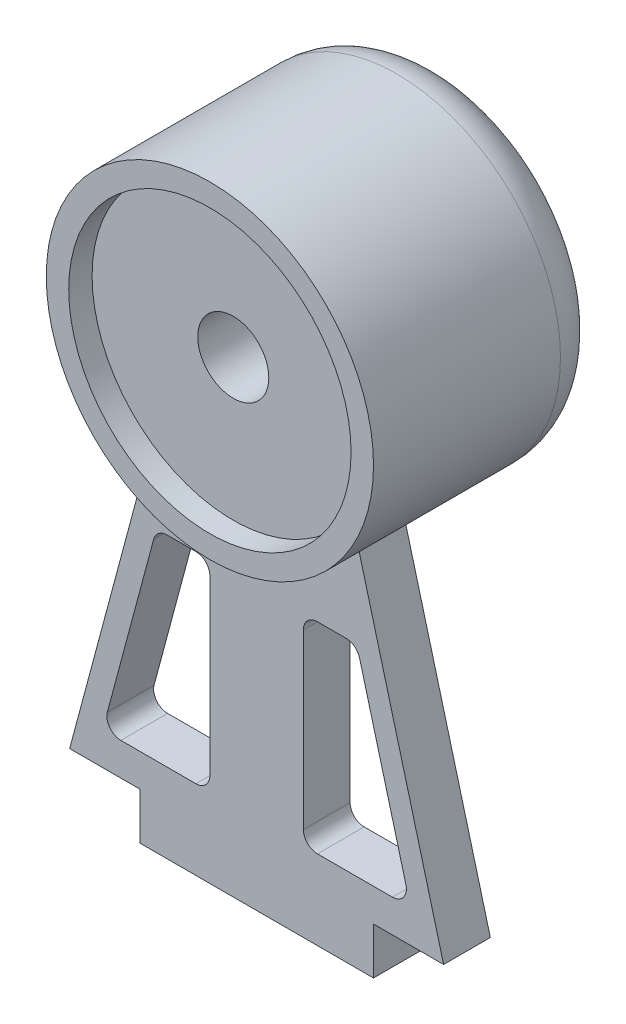
ISO-10303-21;
HEADER;
FILE_DESCRIPTION(('STEP AP214'),'2;1');
FILE_NAME('part.step','',(''),(''),'','','');
FILE_SCHEMA(('AUTOMOTIVE_DESIGN { 1 0 10303 214 1 1 1 1 }'));
ENDSEC;
DATA;
#1=APPLICATION_CONTEXT('core data for automotive mechanical design processes');
#2=APPLICATION_PROTOCOL_DEFINITION('international standard','automotive_design',2000,#1);
#3=PRODUCT_CONTEXT('',#1,'mechanical');
#4=PRODUCT('Part','Part','',(#3));
#5=PRODUCT_RELATED_PRODUCT_CATEGORY('part','',(#4));
#6=PRODUCT_DEFINITION_FORMATION('','',#4);
#7=PRODUCT_DEFINITION_CONTEXT('part definition',#1,'design');
#8=PRODUCT_DEFINITION('design','',#6,#7);
#9=PRODUCT_DEFINITION_SHAPE('','',#8);
#10=(LENGTH_UNIT() NAMED_UNIT(*) SI_UNIT(.MILLI.,.METRE.));
#11=(NAMED_UNIT(*) PLANE_ANGLE_UNIT() SI_UNIT($,.RADIAN.));
#12=(NAMED_UNIT(*) SI_UNIT($,.STERADIAN.) SOLID_ANGLE_UNIT());
#13=UNCERTAINTY_MEASURE_WITH_UNIT(LENGTH_MEASURE(1.E-05),#10,'distance_accuracy_value','');
#14=(GEOMETRIC_REPRESENTATION_CONTEXT(3) GLOBAL_UNCERTAINTY_ASSIGNED_CONTEXT((#13)) GLOBAL_UNIT_ASSIGNED_CONTEXT((#10,
#11,#12)) REPRESENTATION_CONTEXT('',''));
#15=CARTESIAN_POINT('',(0.,0.,0.));
#16=DIRECTION('',(0.,0.,1.));
#17=DIRECTION('',(1.,0.,0.));
#18=AXIS2_PLACEMENT_3D('',#15,#16,#17);
#19=CARTESIAN_POINT('',(0.,0.,0.));
#20=DIRECTION('',(0.,0.,1.));
#21=DIRECTION('',(1.,0.,0.));
#22=AXIS2_PLACEMENT_3D('',#19,#20,#21);
#23=CYLINDRICAL_SURFACE('',#22,22.225);
#24=CARTESIAN_POINT('',(0.,0.,9.52499999999999));
#25=DIRECTION('',(0.,0.,1.));
#26=DIRECTION('',(1.,0.,0.));
#27=AXIS2_PLACEMENT_3D('',#24,#25,#26);
#28=CIRCLE('',#27,22.225);
#29=CARTESIAN_POINT('',(22.225,0.,9.52499999999999));
#30=VERTEX_POINT('',#29);
#31=EDGE_CURVE('E404',#30,#30,#28,.T.);
#32=ORIENTED_EDGE('',*,*,#31,.F.);
#33=EDGE_LOOP('',(#32));
#34=FACE_BOUND('',#33,.T.);
#35=CARTESIAN_POINT('',(0.,0.,-15.875));
#36=DIRECTION('',(0.,0.,1.));
#37=DIRECTION('',(1.,0.,0.));
#38=AXIS2_PLACEMENT_3D('',#35,#36,#37);
#39=CIRCLE('',#38,22.225);
#40=CARTESIAN_POINT('',(22.225,0.,-15.875));
#41=VERTEX_POINT('',#40);
#42=EDGE_CURVE('E410',#41,#41,#39,.T.);
#43=ORIENTED_EDGE('',*,*,#42,.T.);
#44=EDGE_LOOP('',(#43));
#45=FACE_BOUND('',#44,.T.);
#46=DIRECTION('',(0.,0.,1.));
#47=VECTOR('',#46,1.);
#48=CARTESIAN_POINT('',(-13.8857617106543,-17.3532776937075,0.));
#49=LINE('',#48,#47);
#50=CARTESIAN_POINT('',(-13.8857617106543,-17.3532776937075,-3.175));
#51=VERTEX_POINT('',#50);
#52=CARTESIAN_POINT('',(-13.8857617106543,-17.3532776937075,3.175));
#53=VERTEX_POINT('',#52);
#54=EDGE_CURVE('E418',#51,#53,#49,.T.);
#55=ORIENTED_EDGE('',*,*,#54,.T.);
#56=CARTESIAN_POINT('',(0.,0.,3.175));
#57=DIRECTION('',(0.,0.,-1.));
#58=DIRECTION('',(-1.,0.,0.));
#59=AXIS2_PLACEMENT_3D('',#56,#57,#58);
#60=CIRCLE('',#59,22.225);
#61=CARTESIAN_POINT('',(13.8857617106543,-17.3532776937075,3.175));
#62=VERTEX_POINT('',#61);
#63=EDGE_CURVE('E425',#53,#62,#60,.F.);
#64=ORIENTED_EDGE('',*,*,#63,.T.);
#65=DIRECTION('',(0.,0.,1.));
#66=VECTOR('',#65,1.);
#67=CARTESIAN_POINT('',(13.8857617106543,-17.3532776937075,0.));
#68=LINE('',#67,#66);
#69=CARTESIAN_POINT('',(13.8857617106543,-17.3532776937075,-3.175));
#70=VERTEX_POINT('',#69);
#71=EDGE_CURVE('E420',#62,#70,#68,.F.);
#72=ORIENTED_EDGE('',*,*,#71,.T.);
#73=CARTESIAN_POINT('',(0.,0.,-3.175));
#74=DIRECTION('',(0.,0.,-1.));
#75=DIRECTION('',(-1.,0.,0.));
#76=AXIS2_PLACEMENT_3D('',#73,#74,#75);
#77=CIRCLE('',#76,22.225);
#78=EDGE_CURVE('E11',#51,#70,#77,.F.);
#79=ORIENTED_EDGE('',*,*,#78,.F.);
#80=EDGE_LOOP('',(#55,#64,#72,#79));
#81=FACE_BOUND('',#80,.T.);
#82=ADVANCED_FACE('F43',(#34,#45,#81),#23,.T.);
#83=CARTESIAN_POINT('',(0.,22.225,9.52499999999999));
#84=DIRECTION('',(0.,0.,-1.));
#85=DIRECTION('',(-1.,0.,0.));
#86=AXIS2_PLACEMENT_3D('',#83,#84,#85);
#87=PLANE('',#86);
#88=CARTESIAN_POINT('',(0.,0.,9.525));
#89=DIRECTION('',(0.,0.,1.));
#90=DIRECTION('',(1.,0.,0.));
#91=AXIS2_PLACEMENT_3D('',#88,#89,#90);
#92=CIRCLE('',#91,19.177);
#93=CARTESIAN_POINT('',(19.177,0.,9.525));
#94=VERTEX_POINT('',#93);
#95=EDGE_CURVE('E399',#94,#94,#92,.T.);
#96=ORIENTED_EDGE('',*,*,#95,.F.);
#97=EDGE_LOOP('',(#96));
#98=FACE_BOUND('',#97,.T.);
#99=ORIENTED_EDGE('',*,*,#31,.T.);
#100=EDGE_LOOP('',(#99));
#101=FACE_BOUND('',#100,.T.);
#102=ADVANCED_FACE('F539',(#98,#101),#87,.F.);
#103=CARTESIAN_POINT('',(0.,0.,-22.225));
#104=DIRECTION('',(0.,0.,1.));
#105=DIRECTION('',(1.,0.,0.));
#106=AXIS2_PLACEMENT_3D('',#103,#104,#105);
#107=PLANE('',#106);
#108=CARTESIAN_POINT('',(0.,0.,-22.225));
#109=DIRECTION('',(0.,0.,1.));
#110=DIRECTION('',(1.,0.,0.));
#111=AXIS2_PLACEMENT_3D('',#108,#109,#110);
#112=CIRCLE('',#111,15.875);
#113=CARTESIAN_POINT('',(15.875,0.,-22.225));
#114=VERTEX_POINT('',#113);
#115=EDGE_CURVE('E415',#114,#114,#112,.T.);
#116=ORIENTED_EDGE('',*,*,#115,.F.);
#117=EDGE_LOOP('',(#116));
#118=FACE_BOUND('',#117,.T.);
#119=ADVANCED_FACE('F550',(#118),#107,.F.);
#120=CARTESIAN_POINT('',(0.,0.,-15.875));
#121=DIRECTION('',(0.,0.,1.));
#122=DIRECTION('',(1.,0.,0.));
#123=AXIS2_PLACEMENT_3D('',#120,#121,#122);
#124=TOROIDAL_SURFACE('',#123,15.875,6.35);
#125=ORIENTED_EDGE('',*,*,#42,.F.);
#126=EDGE_LOOP('',(#125));
#127=FACE_BOUND('',#126,.T.);
#128=ORIENTED_EDGE('',*,*,#115,.T.);
#129=EDGE_LOOP('',(#128));
#130=FACE_BOUND('',#129,.T.);
#131=ADVANCED_FACE('F559',(#127,#130),#124,.T.);
#132=CARTESIAN_POINT('',(9.23596496659224,0.,3.175));
#133=DIRECTION('',(-0.965925826289067,-0.258819045102525,0.));
#134=DIRECTION('',(0.258819045102525,-0.965925826289067,0.));
#135=AXIS2_PLACEMENT_3D('',#132,#133,#134);
#136=PLANE('',#135);
#137=ORIENTED_EDGE('',*,*,#71,.F.);
#138=DIRECTION('',(-0.258819045102525,0.965925826289067,0.));
#139=VECTOR('',#138,1.);
#140=CARTESIAN_POINT('',(9.23596496659224,0.,3.175));
#141=LINE('',#140,#139);
#142=CARTESIAN_POINT('',(25.4,-60.325,3.175));
#143=VERTEX_POINT('',#142);
#144=EDGE_CURVE('E426',#143,#62,#141,.T.);
#145=ORIENTED_EDGE('',*,*,#144,.F.);
#146=DIRECTION('',(0.,0.,-1.));
#147=VECTOR('',#146,1.);
#148=CARTESIAN_POINT('',(25.4,-60.325,3.175));
#149=LINE('',#148,#147);
#150=CARTESIAN_POINT('',(25.4,-60.325,-3.175));
#151=VERTEX_POINT('',#150);
#152=EDGE_CURVE('E448',#143,#151,#149,.T.);
#153=ORIENTED_EDGE('',*,*,#152,.T.);
#154=DIRECTION('',(-0.258819045102525,0.965925826289067,0.));
#155=VECTOR('',#154,1.);
#156=CARTESIAN_POINT('',(9.23596496659224,0.,-3.175));
#157=LINE('',#156,#155);
#158=EDGE_CURVE('E422',#151,#70,#157,.T.);
#159=ORIENTED_EDGE('',*,*,#158,.T.);
#160=EDGE_LOOP('',(#137,#145,#153,#159));
#161=FACE_BOUND('',#160,.T.);
#162=ADVANCED_FACE('F44',(#161),#136,.F.);
#163=CARTESIAN_POINT('',(-9.23596496659224,0.,3.175));
#164=DIRECTION('',(0.965925826289067,-0.258819045102525,0.));
#165=DIRECTION('',(0.258819045102525,0.965925826289067,0.));
#166=AXIS2_PLACEMENT_3D('',#163,#164,#165);
#167=PLANE('',#166);
#168=ORIENTED_EDGE('',*,*,#54,.F.);
#169=DIRECTION('',(-0.258819045102525,-0.965925826289067,0.));
#170=VECTOR('',#169,1.);
#171=CARTESIAN_POINT('',(-9.23596496659224,0.,-3.175));
#172=LINE('',#171,#170);
#173=CARTESIAN_POINT('',(-25.4,-60.325,-3.175));
#174=VERTEX_POINT('',#173);
#175=EDGE_CURVE('E452',#51,#174,#172,.T.);
#176=ORIENTED_EDGE('',*,*,#175,.T.);
#177=DIRECTION('',(0.,0.,-1.));
#178=VECTOR('',#177,1.);
#179=CARTESIAN_POINT('',(-25.4,-60.325,3.175));
#180=LINE('',#179,#178);
#181=CARTESIAN_POINT('',(-25.4,-60.325,3.175));
#182=VERTEX_POINT('',#181);
#183=EDGE_CURVE('E55',#182,#174,#180,.T.);
#184=ORIENTED_EDGE('',*,*,#183,.F.);
#185=DIRECTION('',(-0.258819045102525,-0.965925826289067,0.));
#186=VECTOR('',#185,1.);
#187=CARTESIAN_POINT('',(-9.23596496659224,0.,3.175));
#188=LINE('',#187,#186);
#189=EDGE_CURVE('E429',#53,#182,#188,.T.);
#190=ORIENTED_EDGE('',*,*,#189,.F.);
#191=EDGE_LOOP('',(#168,#176,#184,#190));
#192=FACE_BOUND('',#191,.T.);
#193=ADVANCED_FACE('F520',(#192),#167,.F.);
#194=CARTESIAN_POINT('',(-25.4,-60.325,3.175));
#195=DIRECTION('',(0.,1.,0.));
#196=DIRECTION('',(0.,0.,1.));
#197=AXIS2_PLACEMENT_3D('',#194,#195,#196);
#198=PLANE('',#197);
#199=DIRECTION('',(1.,0.,0.));
#200=VECTOR('',#199,1.);
#201=CARTESIAN_POINT('',(-25.4,-60.325,-3.175));
#202=LINE('',#201,#200);
#203=CARTESIAN_POINT('',(-15.875,-60.325,-3.175));
#204=VERTEX_POINT('',#203);
#205=EDGE_CURVE('E457',#174,#204,#202,.T.);
#206=ORIENTED_EDGE('',*,*,#205,.T.);
#207=DIRECTION('',(0.,0.,-1.));
#208=VECTOR('',#207,1.);
#209=CARTESIAN_POINT('',(-15.875,-60.325,3.175));
#210=LINE('',#209,#208);
#211=CARTESIAN_POINT('',(-15.875,-60.325,3.175));
#212=VERTEX_POINT('',#211);
#213=EDGE_CURVE('E484',#212,#204,#210,.T.);
#214=ORIENTED_EDGE('',*,*,#213,.F.);
#215=DIRECTION('',(1.,0.,0.));
#216=VECTOR('',#215,1.);
#217=CARTESIAN_POINT('',(-25.4,-60.325,3.175));
#218=LINE('',#217,#216);
#219=EDGE_CURVE('E432',#182,#212,#218,.T.);
#220=ORIENTED_EDGE('',*,*,#219,.F.);
#221=ORIENTED_EDGE('',*,*,#183,.T.);
#222=EDGE_LOOP('',(#206,#214,#220,#221));
#223=FACE_BOUND('',#222,.T.);
#224=ADVANCED_FACE('F494',(#223),#198,.F.);
#225=CARTESIAN_POINT('',(-15.875,-60.325,3.175));
#226=DIRECTION('',(1.,0.,0.));
#227=DIRECTION('',(0.,0.,-1.));
#228=AXIS2_PLACEMENT_3D('',#225,#226,#227);
#229=PLANE('',#228);
#230=DIRECTION('',(0.,-1.,0.));
#231=VECTOR('',#230,1.);
#232=CARTESIAN_POINT('',(-15.875,-60.325,-3.175));
#233=LINE('',#232,#231);
#234=CARTESIAN_POINT('',(-15.875,-66.675,-3.175));
#235=VERTEX_POINT('',#234);
#236=EDGE_CURVE('E459',#204,#235,#233,.T.);
#237=ORIENTED_EDGE('',*,*,#236,.T.);
#238=DIRECTION('',(0.,0.,-1.));
#239=VECTOR('',#238,1.);
#240=CARTESIAN_POINT('',(-15.875,-66.675,3.175));
#241=LINE('',#240,#239);
#242=CARTESIAN_POINT('',(-15.875,-66.675,3.175));
#243=VERTEX_POINT('',#242);
#244=EDGE_CURVE('E481',#243,#235,#241,.T.);
#245=ORIENTED_EDGE('',*,*,#244,.F.);
#246=DIRECTION('',(0.,-1.,0.));
#247=VECTOR('',#246,1.);
#248=CARTESIAN_POINT('',(-15.875,-60.325,3.175));
#249=LINE('',#248,#247);
#250=EDGE_CURVE('E440',#212,#243,#249,.T.);
#251=ORIENTED_EDGE('',*,*,#250,.F.);
#252=ORIENTED_EDGE('',*,*,#213,.T.);
#253=EDGE_LOOP('',(#237,#245,#251,#252));
#254=FACE_BOUND('',#253,.T.);
#255=ADVANCED_FACE('F510',(#254),#229,.F.);
#256=CARTESIAN_POINT('',(15.875,-66.675,3.175));
#257=DIRECTION('',(0.,1.,0.));
#258=DIRECTION('',(0.,0.,1.));
#259=AXIS2_PLACEMENT_3D('',#256,#257,#258);
#260=PLANE('',#259);
#261=DIRECTION('',(1.,0.,0.));
#262=VECTOR('',#261,1.);
#263=CARTESIAN_POINT('',(15.875,-66.675,-3.175));
#264=LINE('',#263,#262);
#265=CARTESIAN_POINT('',(15.875,-66.675,-3.175));
#266=VERTEX_POINT('',#265);
#267=EDGE_CURVE('E461',#235,#266,#264,.T.);
#268=ORIENTED_EDGE('',*,*,#267,.T.);
#269=DIRECTION('',(0.,0.,-1.));
#270=VECTOR('',#269,1.);
#271=CARTESIAN_POINT('',(15.875,-66.675,3.175));
#272=LINE('',#271,#270);
#273=CARTESIAN_POINT('',(15.875,-66.675,3.175));
#274=VERTEX_POINT('',#273);
#275=EDGE_CURVE('E480',#274,#266,#272,.T.);
#276=ORIENTED_EDGE('',*,*,#275,.F.);
#277=DIRECTION('',(1.,0.,0.));
#278=VECTOR('',#277,1.);
#279=CARTESIAN_POINT('',(15.875,-66.675,3.175));
#280=LINE('',#279,#278);
#281=EDGE_CURVE('E439',#243,#274,#280,.T.);
#282=ORIENTED_EDGE('',*,*,#281,.F.);
#283=ORIENTED_EDGE('',*,*,#244,.T.);
#284=EDGE_LOOP('',(#268,#276,#282,#283));
#285=FACE_BOUND('',#284,.T.);
#286=ADVANCED_FACE('F512',(#285),#260,.F.);
#287=CARTESIAN_POINT('',(15.875,-60.325,3.175));
#288=DIRECTION('',(-1.,0.,0.));
#289=DIRECTION('',(0.,0.,1.));
#290=AXIS2_PLACEMENT_3D('',#287,#288,#289);
#291=PLANE('',#290);
#292=DIRECTION('',(0.,1.,0.));
#293=VECTOR('',#292,1.);
#294=CARTESIAN_POINT('',(15.875,-60.325,-3.175));
#295=LINE('',#294,#293);
#296=CARTESIAN_POINT('',(15.875,-60.325,-3.175));
#297=VERTEX_POINT('',#296);
#298=EDGE_CURVE('E462',#266,#297,#295,.T.);
#299=ORIENTED_EDGE('',*,*,#298,.T.);
#300=DIRECTION('',(0.,0.,-1.));
#301=VECTOR('',#300,1.);
#302=CARTESIAN_POINT('',(15.875,-60.325,3.175));
#303=LINE('',#302,#301);
#304=CARTESIAN_POINT('',(15.875,-60.325,3.175));
#305=VERTEX_POINT('',#304);
#306=EDGE_CURVE('E471',#305,#297,#303,.T.);
#307=ORIENTED_EDGE('',*,*,#306,.F.);
#308=DIRECTION('',(0.,1.,0.));
#309=VECTOR('',#308,1.);
#310=CARTESIAN_POINT('',(15.875,-60.325,3.175));
#311=LINE('',#310,#309);
#312=EDGE_CURVE('E444',#274,#305,#311,.T.);
#313=ORIENTED_EDGE('',*,*,#312,.F.);
#314=ORIENTED_EDGE('',*,*,#275,.T.);
#315=EDGE_LOOP('',(#299,#307,#313,#314));
#316=FACE_BOUND('',#315,.T.);
#317=ADVANCED_FACE('F529',(#316),#291,.F.);
#318=CARTESIAN_POINT('',(25.4,-60.325,3.175));
#319=DIRECTION('',(0.,1.,0.));
#320=DIRECTION('',(0.,0.,1.));
#321=AXIS2_PLACEMENT_3D('',#318,#319,#320);
#322=PLANE('',#321);
#323=DIRECTION('',(1.,0.,0.));
#324=VECTOR('',#323,1.);
#325=CARTESIAN_POINT('',(25.4,-60.325,-3.175));
#326=LINE('',#325,#324);
#327=EDGE_CURVE('E431',#297,#151,#326,.T.);
#328=ORIENTED_EDGE('',*,*,#327,.T.);
#329=ORIENTED_EDGE('',*,*,#152,.F.);
#330=DIRECTION('',(1.,0.,0.));
#331=VECTOR('',#330,1.);
#332=CARTESIAN_POINT('',(25.4,-60.325,3.175));
#333=LINE('',#332,#331);
#334=EDGE_CURVE('E449',#305,#143,#333,.T.);
#335=ORIENTED_EDGE('',*,*,#334,.F.);
#336=ORIENTED_EDGE('',*,*,#306,.T.);
#337=EDGE_LOOP('',(#328,#329,#335,#336));
#338=FACE_BOUND('',#337,.T.);
#339=ADVANCED_FACE('F526',(#338),#322,.F.);
#340=CARTESIAN_POINT('',(0.,0.,3.175));
#341=DIRECTION('',(0.,0.,-1.));
#342=DIRECTION('',(-1.,0.,0.));
#343=AXIS2_PLACEMENT_3D('',#340,#341,#342);
#344=PLANE('',#343);
#345=DIRECTION('',(-1.,0.,0.));
#346=VECTOR('',#345,1.);
#347=CARTESIAN_POINT('',(18.4393196315791,-55.88,3.175));
#348=LINE('',#347,#346);
#349=CARTESIAN_POINT('',(18.4393196315791,-55.88,3.175));
#350=VERTEX_POINT('',#349);
#351=CARTESIAN_POINT('',(8.255,-55.88,3.175));
#352=VERTEX_POINT('',#351);
#353=EDGE_CURVE('E217',#350,#352,#348,.T.);
#354=ORIENTED_EDGE('',*,*,#353,.T.);
#355=CARTESIAN_POINT('',(8.25499999999998,-53.975,3.175));
#356=DIRECTION('',(0.,0.,-1.));
#357=DIRECTION('',(-1.,0.,0.));
#358=AXIS2_PLACEMENT_3D('',#355,#356,#357);
#359=CIRCLE('',#358,1.905);
#360=CARTESIAN_POINT('',(6.34999999999999,-53.975,3.175));
#361=VERTEX_POINT('',#360);
#362=EDGE_CURVE('E207',#352,#361,#359,.T.);
#363=ORIENTED_EDGE('',*,*,#362,.T.);
#364=DIRECTION('',(0.,1.,0.));
#365=VECTOR('',#364,1.);
#366=CARTESIAN_POINT('',(6.34999999999999,-53.975,3.175));
#367=LINE('',#366,#365);
#368=CARTESIAN_POINT('',(6.34999999999999,-30.48,3.175));
#369=VERTEX_POINT('',#368);
#370=EDGE_CURVE('E222',#361,#369,#367,.T.);
#371=ORIENTED_EDGE('',*,*,#370,.T.);
#372=CARTESIAN_POINT('',(8.25499999999999,-30.48,3.175));
#373=DIRECTION('',(0.,0.,-1.));
#374=DIRECTION('',(-1.,0.,0.));
#375=AXIS2_PLACEMENT_3D('',#372,#373,#374);
#376=CIRCLE('',#375,1.905);
#377=CARTESIAN_POINT('',(8.255,-28.575,3.175));
#378=VERTEX_POINT('',#377);
#379=EDGE_CURVE('E56',#369,#378,#376,.T.);
#380=ORIENTED_EDGE('',*,*,#379,.T.);
#381=DIRECTION('',(1.,0.,0.));
#382=VECTOR('',#381,1.);
#383=CARTESIAN_POINT('',(8.255,-28.575,3.175));
#384=LINE('',#383,#382);
#385=CARTESIAN_POINT('',(12.1438533554098,-28.575,3.175));
#386=VERTEX_POINT('',#385);
#387=EDGE_CURVE('E244',#378,#386,#384,.T.);
#388=ORIENTED_EDGE('',*,*,#387,.T.);
#389=CARTESIAN_POINT('',(12.1438533554098,-30.48,3.175));
#390=DIRECTION('',(0.,0.,-1.));
#391=DIRECTION('',(1.,0.,0.));
#392=AXIS2_PLACEMENT_3D('',#389,#390,#391);
#393=CIRCLE('',#392,1.905);
#394=CARTESIAN_POINT('',(13.9839420544905,-29.9869497190797,3.175));
#395=VERTEX_POINT('',#394);
#396=EDGE_CURVE('E242',#386,#395,#393,.T.);
#397=ORIENTED_EDGE('',*,*,#396,.T.);
#398=DIRECTION('',(0.258819045102525,-0.965925826289067,0.));
#399=VECTOR('',#398,1.);
#400=CARTESIAN_POINT('',(13.9839420544905,-29.9869497190797,3.175));
#401=LINE('',#400,#399);
#402=CARTESIAN_POINT('',(20.2794083306598,-53.4819497190797,3.175));
#403=VERTEX_POINT('',#402);
#404=EDGE_CURVE('E248',#395,#403,#401,.T.);
#405=ORIENTED_EDGE('',*,*,#404,.T.);
#406=CARTESIAN_POINT('',(18.4393196315791,-53.975,3.175));
#407=DIRECTION('',(0.,0.,-1.));
#408=DIRECTION('',(-1.,0.,0.));
#409=AXIS2_PLACEMENT_3D('',#406,#407,#408);
#410=CIRCLE('',#409,1.905);
#411=EDGE_CURVE('E251',#403,#350,#410,.T.);
#412=ORIENTED_EDGE('',*,*,#411,.T.);
#413=EDGE_LOOP('',(#354,#363,#371,#380,#388,#397,#405,#412));
#414=FACE_BOUND('',#413,.T.);
#415=DIRECTION('',(0.258819045102525,0.965925826289067,0.));
#416=VECTOR('',#415,1.);
#417=CARTESIAN_POINT('',(-13.9839420544905,-29.9869497190797,3.175));
#418=LINE('',#417,#416);
#419=CARTESIAN_POINT('',(-20.2794083306598,-53.4819497190797,3.175));
#420=VERTEX_POINT('',#419);
#421=CARTESIAN_POINT('',(-13.9839420544905,-29.9869497190797,3.175));
#422=VERTEX_POINT('',#421);
#423=EDGE_CURVE('E306',#420,#422,#418,.T.);
#424=ORIENTED_EDGE('',*,*,#423,.T.);
#425=CARTESIAN_POINT('',(-12.1438533554098,-30.48,3.175));
#426=DIRECTION('',(0.,0.,-1.));
#427=DIRECTION('',(-1.,0.,0.));
#428=AXIS2_PLACEMENT_3D('',#425,#426,#427);
#429=CIRCLE('',#428,1.905);
#430=CARTESIAN_POINT('',(-12.1438533554098,-28.575,3.175));
#431=VERTEX_POINT('',#430);
#432=EDGE_CURVE('E333',#422,#431,#429,.T.);
#433=ORIENTED_EDGE('',*,*,#432,.T.);
#434=DIRECTION('',(1.,0.,0.));
#435=VECTOR('',#434,1.);
#436=CARTESIAN_POINT('',(-8.255,-28.575,3.175));
#437=LINE('',#436,#435);
#438=CARTESIAN_POINT('',(-8.255,-28.575,3.175));
#439=VERTEX_POINT('',#438);
#440=EDGE_CURVE('E385',#431,#439,#437,.T.);
#441=ORIENTED_EDGE('',*,*,#440,.T.);
#442=CARTESIAN_POINT('',(-8.25499999999999,-30.48,3.175));
#443=DIRECTION('',(0.,0.,-1.));
#444=DIRECTION('',(1.,0.,0.));
#445=AXIS2_PLACEMENT_3D('',#442,#443,#444);
#446=CIRCLE('',#445,1.905);
#447=CARTESIAN_POINT('',(-6.34999999999999,-30.48,3.175));
#448=VERTEX_POINT('',#447);
#449=EDGE_CURVE('E70',#439,#448,#446,.T.);
#450=ORIENTED_EDGE('',*,*,#449,.T.);
#451=DIRECTION('',(0.,-1.,0.));
#452=VECTOR('',#451,1.);
#453=CARTESIAN_POINT('',(-6.34999999999999,-53.975,3.175));
#454=LINE('',#453,#452);
#455=CARTESIAN_POINT('',(-6.34999999999999,-53.975,3.175));
#456=VERTEX_POINT('',#455);
#457=EDGE_CURVE('E376',#448,#456,#454,.T.);
#458=ORIENTED_EDGE('',*,*,#457,.T.);
#459=CARTESIAN_POINT('',(-8.25499999999998,-53.975,3.175));
#460=DIRECTION('',(0.,0.,-1.));
#461=DIRECTION('',(1.,0.,0.));
#462=AXIS2_PLACEMENT_3D('',#459,#460,#461);
#463=CIRCLE('',#462,1.905);
#464=CARTESIAN_POINT('',(-8.255,-55.88,3.175));
#465=VERTEX_POINT('',#464);
#466=EDGE_CURVE('E375',#456,#465,#463,.T.);
#467=ORIENTED_EDGE('',*,*,#466,.T.);
#468=DIRECTION('',(-1.,0.,0.));
#469=VECTOR('',#468,1.);
#470=CARTESIAN_POINT('',(-18.4393196315791,-55.88,3.175));
#471=LINE('',#470,#469);
#472=CARTESIAN_POINT('',(-18.4393196315791,-55.88,3.175));
#473=VERTEX_POINT('',#472);
#474=EDGE_CURVE('E366',#465,#473,#471,.T.);
#475=ORIENTED_EDGE('',*,*,#474,.T.);
#476=CARTESIAN_POINT('',(-18.4393196315791,-53.975,3.175));
#477=DIRECTION('',(0.,0.,-1.));
#478=DIRECTION('',(1.,0.,0.));
#479=AXIS2_PLACEMENT_3D('',#476,#477,#478);
#480=CIRCLE('',#479,1.905);
#481=EDGE_CURVE('E365',#473,#420,#480,.T.);
#482=ORIENTED_EDGE('',*,*,#481,.T.);
#483=EDGE_LOOP('',(#424,#433,#441,#450,#458,#467,#475,#482));
#484=FACE_BOUND('',#483,.T.);
#485=ORIENTED_EDGE('',*,*,#63,.F.);
#486=ORIENTED_EDGE('',*,*,#189,.T.);
#487=ORIENTED_EDGE('',*,*,#219,.T.);
#488=ORIENTED_EDGE('',*,*,#250,.T.);
#489=ORIENTED_EDGE('',*,*,#281,.T.);
#490=ORIENTED_EDGE('',*,*,#312,.T.);
#491=ORIENTED_EDGE('',*,*,#334,.T.);
#492=ORIENTED_EDGE('',*,*,#144,.T.);
#493=EDGE_LOOP('',(#485,#486,#487,#488,#489,#490,#491,#492));
#494=FACE_BOUND('',#493,.T.);
#495=ADVANCED_FACE('F229',(#414,#484,#494),#344,.F.);
#496=CARTESIAN_POINT('',(0.,0.,-3.175));
#497=DIRECTION('',(0.,0.,-1.));
#498=DIRECTION('',(-1.,0.,0.));
#499=AXIS2_PLACEMENT_3D('',#496,#497,#498);
#500=PLANE('',#499);
#501=CARTESIAN_POINT('',(8.25499999999998,-53.975,-3.175));
#502=DIRECTION('',(0.,0.,-1.));
#503=DIRECTION('',(-1.,0.,0.));
#504=AXIS2_PLACEMENT_3D('',#501,#502,#503);
#505=CIRCLE('',#504,1.905);
#506=CARTESIAN_POINT('',(8.255,-55.88,-3.175));
#507=VERTEX_POINT('',#506);
#508=CARTESIAN_POINT('',(6.34999999999999,-53.975,-3.175));
#509=VERTEX_POINT('',#508);
#510=EDGE_CURVE('E215',#507,#509,#505,.T.);
#511=ORIENTED_EDGE('',*,*,#510,.F.);
#512=DIRECTION('',(-1.,0.,0.));
#513=VECTOR('',#512,1.);
#514=CARTESIAN_POINT('',(18.4393196315791,-55.88,-3.175));
#515=LINE('',#514,#513);
#516=CARTESIAN_POINT('',(18.4393196315791,-55.88,-3.175));
#517=VERTEX_POINT('',#516);
#518=EDGE_CURVE('E231',#517,#507,#515,.T.);
#519=ORIENTED_EDGE('',*,*,#518,.F.);
#520=CARTESIAN_POINT('',(18.4393196315791,-53.975,-3.175));
#521=DIRECTION('',(0.,0.,-1.));
#522=DIRECTION('',(-1.,0.,0.));
#523=AXIS2_PLACEMENT_3D('',#520,#521,#522);
#524=CIRCLE('',#523,1.905);
#525=CARTESIAN_POINT('',(20.2794083306598,-53.4819497190797,-3.175));
#526=VERTEX_POINT('',#525);
#527=EDGE_CURVE('E237',#526,#517,#524,.T.);
#528=ORIENTED_EDGE('',*,*,#527,.F.);
#529=DIRECTION('',(0.258819045102525,-0.965925826289067,0.));
#530=VECTOR('',#529,1.);
#531=CARTESIAN_POINT('',(13.9839420544905,-29.9869497190797,-3.175));
#532=LINE('',#531,#530);
#533=CARTESIAN_POINT('',(13.9839420544905,-29.9869497190797,-3.175));
#534=VERTEX_POINT('',#533);
#535=EDGE_CURVE('E277',#534,#526,#532,.T.);
#536=ORIENTED_EDGE('',*,*,#535,.F.);
#537=CARTESIAN_POINT('',(12.1438533554098,-30.48,-3.175));
#538=DIRECTION('',(0.,0.,-1.));
#539=DIRECTION('',(1.,0.,0.));
#540=AXIS2_PLACEMENT_3D('',#537,#538,#539);
#541=CIRCLE('',#540,1.905);
#542=CARTESIAN_POINT('',(12.1438533554098,-28.575,-3.175));
#543=VERTEX_POINT('',#542);
#544=EDGE_CURVE('E275',#543,#534,#541,.T.);
#545=ORIENTED_EDGE('',*,*,#544,.F.);
#546=DIRECTION('',(1.,0.,0.));
#547=VECTOR('',#546,1.);
#548=CARTESIAN_POINT('',(8.255,-28.575,-3.175));
#549=LINE('',#548,#547);
#550=CARTESIAN_POINT('',(8.255,-28.575,-3.175));
#551=VERTEX_POINT('',#550);
#552=EDGE_CURVE('E268',#551,#543,#549,.T.);
#553=ORIENTED_EDGE('',*,*,#552,.F.);
#554=CARTESIAN_POINT('',(8.25499999999999,-30.48,-3.175));
#555=DIRECTION('',(0.,0.,-1.));
#556=DIRECTION('',(-1.,0.,0.));
#557=AXIS2_PLACEMENT_3D('',#554,#555,#556);
#558=CIRCLE('',#557,1.905);
#559=CARTESIAN_POINT('',(6.34999999999999,-30.48,-3.175));
#560=VERTEX_POINT('',#559);
#561=EDGE_CURVE('E262',#560,#551,#558,.T.);
#562=ORIENTED_EDGE('',*,*,#561,.F.);
#563=DIRECTION('',(0.,1.,0.));
#564=VECTOR('',#563,1.);
#565=CARTESIAN_POINT('',(6.34999999999999,-53.975,-3.175));
#566=LINE('',#565,#564);
#567=EDGE_CURVE('E257',#509,#560,#566,.T.);
#568=ORIENTED_EDGE('',*,*,#567,.F.);
#569=EDGE_LOOP('',(#511,#519,#528,#536,#545,#553,#562,#568));
#570=FACE_BOUND('',#569,.T.);
#571=CARTESIAN_POINT('',(-12.1438533554098,-30.48,-3.175));
#572=DIRECTION('',(0.,0.,-1.));
#573=DIRECTION('',(-1.,0.,0.));
#574=AXIS2_PLACEMENT_3D('',#571,#572,#573);
#575=CIRCLE('',#574,1.905);
#576=CARTESIAN_POINT('',(-13.9839420544905,-29.9869497190797,-3.175));
#577=VERTEX_POINT('',#576);
#578=CARTESIAN_POINT('',(-12.1438533554098,-28.575,-3.175));
#579=VERTEX_POINT('',#578);
#580=EDGE_CURVE('E261',#577,#579,#575,.T.);
#581=ORIENTED_EDGE('',*,*,#580,.F.);
#582=DIRECTION('',(0.258819045102525,0.965925826289067,0.));
#583=VECTOR('',#582,1.);
#584=CARTESIAN_POINT('',(-13.9839420544905,-29.9869497190797,-3.175));
#585=LINE('',#584,#583);
#586=CARTESIAN_POINT('',(-20.2794083306598,-53.4819497190797,-3.175));
#587=VERTEX_POINT('',#586);
#588=EDGE_CURVE('E329',#587,#577,#585,.T.);
#589=ORIENTED_EDGE('',*,*,#588,.F.);
#590=CARTESIAN_POINT('',(-18.4393196315791,-53.975,-3.175));
#591=DIRECTION('',(0.,0.,-1.));
#592=DIRECTION('',(1.,0.,0.));
#593=AXIS2_PLACEMENT_3D('',#590,#591,#592);
#594=CIRCLE('',#593,1.905);
#595=CARTESIAN_POINT('',(-18.4393196315791,-55.88,-3.175));
#596=VERTEX_POINT('',#595);
#597=EDGE_CURVE('E331',#596,#587,#594,.T.);
#598=ORIENTED_EDGE('',*,*,#597,.F.);
#599=DIRECTION('',(-1.,0.,0.));
#600=VECTOR('',#599,1.);
#601=CARTESIAN_POINT('',(-18.4393196315791,-55.88,-3.175));
#602=LINE('',#601,#600);
#603=CARTESIAN_POINT('',(-8.255,-55.88,-3.175));
#604=VERTEX_POINT('',#603);
#605=EDGE_CURVE('E338',#604,#596,#602,.T.);
#606=ORIENTED_EDGE('',*,*,#605,.F.);
#607=CARTESIAN_POINT('',(-8.25499999999998,-53.975,-3.175));
#608=DIRECTION('',(0.,0.,-1.));
#609=DIRECTION('',(1.,0.,0.));
#610=AXIS2_PLACEMENT_3D('',#607,#608,#609);
#611=CIRCLE('',#610,1.905);
#612=CARTESIAN_POINT('',(-6.34999999999999,-53.975,-3.175));
#613=VERTEX_POINT('',#612);
#614=EDGE_CURVE('E342',#613,#604,#611,.T.);
#615=ORIENTED_EDGE('',*,*,#614,.F.);
#616=DIRECTION('',(0.,-1.,0.));
#617=VECTOR('',#616,1.);
#618=CARTESIAN_POINT('',(-6.34999999999999,-53.975,-3.175));
#619=LINE('',#618,#617);
#620=CARTESIAN_POINT('',(-6.34999999999999,-30.48,-3.175));
#621=VERTEX_POINT('',#620);
#622=EDGE_CURVE('E350',#621,#613,#619,.T.);
#623=ORIENTED_EDGE('',*,*,#622,.F.);
#624=CARTESIAN_POINT('',(-8.25499999999999,-30.48,-3.175));
#625=DIRECTION('',(0.,0.,-1.));
#626=DIRECTION('',(1.,0.,0.));
#627=AXIS2_PLACEMENT_3D('',#624,#625,#626);
#628=CIRCLE('',#627,1.905);
#629=CARTESIAN_POINT('',(-8.255,-28.575,-3.175));
#630=VERTEX_POINT('',#629);
#631=EDGE_CURVE('E354',#630,#621,#628,.T.);
#632=ORIENTED_EDGE('',*,*,#631,.F.);
#633=DIRECTION('',(1.,0.,0.));
#634=VECTOR('',#633,1.);
#635=CARTESIAN_POINT('',(-8.255,-28.575,-3.175));
#636=LINE('',#635,#634);
#637=EDGE_CURVE('E352',#579,#630,#636,.T.);
#638=ORIENTED_EDGE('',*,*,#637,.F.);
#639=EDGE_LOOP('',(#581,#589,#598,#606,#615,#623,#632,#638));
#640=FACE_BOUND('',#639,.T.);
#641=ORIENTED_EDGE('',*,*,#175,.F.);
#642=ORIENTED_EDGE('',*,*,#78,.T.);
#643=ORIENTED_EDGE('',*,*,#158,.F.);
#644=ORIENTED_EDGE('',*,*,#327,.F.);
#645=ORIENTED_EDGE('',*,*,#298,.F.);
#646=ORIENTED_EDGE('',*,*,#267,.F.);
#647=ORIENTED_EDGE('',*,*,#236,.F.);
#648=ORIENTED_EDGE('',*,*,#205,.F.);
#649=EDGE_LOOP('',(#641,#642,#643,#644,#645,#646,#647,#648));
#650=FACE_BOUND('',#649,.T.);
#651=ADVANCED_FACE('F501',(#570,#640,#650),#500,.T.);
#652=CARTESIAN_POINT('',(0.,0.,9.52499999999999));
#653=DIRECTION('',(0.,0.,1.));
#654=DIRECTION('',(1.,0.,0.));
#655=AXIS2_PLACEMENT_3D('',#652,#653,#654);
#656=CYLINDRICAL_SURFACE('',#655,19.177);
#657=ORIENTED_EDGE('',*,*,#95,.T.);
#658=EDGE_LOOP('',(#657));
#659=FACE_BOUND('',#658,.T.);
#660=CARTESIAN_POINT('',(0.,0.,6.35));
#661=DIRECTION('',(0.,0.,1.));
#662=DIRECTION('',(1.,0.,0.));
#663=AXIS2_PLACEMENT_3D('',#660,#661,#662);
#664=CIRCLE('',#663,19.177);
#665=CARTESIAN_POINT('',(19.177,0.,6.35));
#666=VERTEX_POINT('',#665);
#667=EDGE_CURVE('E396',#666,#666,#664,.T.);
#668=ORIENTED_EDGE('',*,*,#667,.F.);
#669=EDGE_LOOP('',(#668));
#670=FACE_BOUND('',#669,.T.);
#671=ADVANCED_FACE('F551',(#659,#670),#656,.F.);
#672=CARTESIAN_POINT('',(0.,19.177,6.35));
#673=DIRECTION('',(0.,0.,1.));
#674=DIRECTION('',(1.,0.,0.));
#675=AXIS2_PLACEMENT_3D('',#672,#673,#674);
#676=PLANE('',#675);
#677=ORIENTED_EDGE('',*,*,#667,.T.);
#678=EDGE_LOOP('',(#677));
#679=FACE_BOUND('',#678,.T.);
#680=CARTESIAN_POINT('',(0.,0.,6.34999999999999));
#681=DIRECTION('',(0.,0.,1.));
#682=DIRECTION('',(1.,0.,0.));
#683=AXIS2_PLACEMENT_3D('',#680,#681,#682);
#684=CIRCLE('',#683,4.826);
#685=CARTESIAN_POINT('',(4.826,0.,6.34999999999999));
#686=VERTEX_POINT('',#685);
#687=EDGE_CURVE('E391',#686,#686,#684,.T.);
#688=ORIENTED_EDGE('',*,*,#687,.F.);
#689=EDGE_LOOP('',(#688));
#690=FACE_BOUND('',#689,.T.);
#691=ADVANCED_FACE('F568',(#679,#690),#676,.T.);
#692=CARTESIAN_POINT('',(0.,0.,9.52499999999999));
#693=DIRECTION('',(0.,0.,1.));
#694=DIRECTION('',(1.,0.,0.));
#695=AXIS2_PLACEMENT_3D('',#692,#693,#694);
#696=CYLINDRICAL_SURFACE('',#695,4.826);
#697=ORIENTED_EDGE('',*,*,#687,.T.);
#698=EDGE_LOOP('',(#697));
#699=FACE_BOUND('',#698,.T.);
#700=CARTESIAN_POINT('',(0.,0.,-12.954));
#701=DIRECTION('',(0.,0.,1.));
#702=DIRECTION('',(1.,0.,0.));
#703=AXIS2_PLACEMENT_3D('',#700,#701,#702);
#704=CIRCLE('',#703,4.826);
#705=CARTESIAN_POINT('',(4.826,0.,-12.954));
#706=VERTEX_POINT('',#705);
#707=EDGE_CURVE('E286',#706,#706,#704,.T.);
#708=ORIENTED_EDGE('',*,*,#707,.F.);
#709=EDGE_LOOP('',(#708));
#710=FACE_BOUND('',#709,.T.);
#711=ADVANCED_FACE('F623',(#699,#710),#696,.F.);
#712=CARTESIAN_POINT('',(0.,4.826,-12.954));
#713=DIRECTION('',(0.,0.,1.));
#714=DIRECTION('',(1.,0.,0.));
#715=AXIS2_PLACEMENT_3D('',#712,#713,#714);
#716=PLANE('',#715);
#717=ORIENTED_EDGE('',*,*,#707,.T.);
#718=EDGE_LOOP('',(#717));
#719=FACE_BOUND('',#718,.T.);
#720=ADVANCED_FACE('F625',(#719),#716,.T.);
#721=CARTESIAN_POINT('',(-12.1438533554098,-30.48,3.175));
#722=DIRECTION('',(0.,0.,-1.));
#723=DIRECTION('',(-1.,0.,0.));
#724=AXIS2_PLACEMENT_3D('',#721,#722,#723);
#725=CYLINDRICAL_SURFACE('',#724,1.905);
#726=ORIENTED_EDGE('',*,*,#580,.T.);
#727=DIRECTION('',(0.,0.,-1.));
#728=VECTOR('',#727,1.);
#729=CARTESIAN_POINT('',(-12.1438533554098,-28.575,3.175));
#730=LINE('',#729,#728);
#731=EDGE_CURVE('E303',#431,#579,#730,.T.);
#732=ORIENTED_EDGE('',*,*,#731,.F.);
#733=ORIENTED_EDGE('',*,*,#432,.F.);
#734=DIRECTION('',(0.,0.,-1.));
#735=VECTOR('',#734,1.);
#736=CARTESIAN_POINT('',(-13.9839420544905,-29.9869497190797,3.175));
#737=LINE('',#736,#735);
#738=EDGE_CURVE('E330',#422,#577,#737,.T.);
#739=ORIENTED_EDGE('',*,*,#738,.T.);
#740=EDGE_LOOP('',(#726,#732,#733,#739));
#741=FACE_BOUND('',#740,.T.);
#742=ADVANCED_FACE('F579',(#741),#725,.F.);
#743=CARTESIAN_POINT('',(-13.9839420544905,-29.9869497190797,3.175));
#744=DIRECTION('',(-0.965925826289067,0.258819045102525,0.));
#745=DIRECTION('',(-0.258819045102525,-0.965925826289067,0.));
#746=AXIS2_PLACEMENT_3D('',#743,#744,#745);
#747=PLANE('',#746);
#748=ORIENTED_EDGE('',*,*,#588,.T.);
#749=ORIENTED_EDGE('',*,*,#738,.F.);
#750=ORIENTED_EDGE('',*,*,#423,.F.);
#751=DIRECTION('',(0.,0.,-1.));
#752=VECTOR('',#751,1.);
#753=CARTESIAN_POINT('',(-20.2794083306598,-53.4819497190797,3.175));
#754=LINE('',#753,#752);
#755=EDGE_CURVE('E322',#420,#587,#754,.T.);
#756=ORIENTED_EDGE('',*,*,#755,.T.);
#757=EDGE_LOOP('',(#748,#749,#750,#756));
#758=FACE_BOUND('',#757,.T.);
#759=ADVANCED_FACE('F586',(#758),#747,.F.);
#760=CARTESIAN_POINT('',(-18.4393196315791,-53.975,3.175));
#761=DIRECTION('',(0.,0.,-1.));
#762=DIRECTION('',(-1.,0.,0.));
#763=AXIS2_PLACEMENT_3D('',#760,#761,#762);
#764=CYLINDRICAL_SURFACE('',#763,1.905);
#765=ORIENTED_EDGE('',*,*,#597,.T.);
#766=ORIENTED_EDGE('',*,*,#755,.F.);
#767=ORIENTED_EDGE('',*,*,#481,.F.);
#768=DIRECTION('',(0.,0.,-1.));
#769=VECTOR('',#768,1.);
#770=CARTESIAN_POINT('',(-18.4393196315791,-55.88,3.175));
#771=LINE('',#770,#769);
#772=EDGE_CURVE('E321',#473,#596,#771,.T.);
#773=ORIENTED_EDGE('',*,*,#772,.T.);
#774=EDGE_LOOP('',(#765,#766,#767,#773));
#775=FACE_BOUND('',#774,.T.);
#776=ADVANCED_FACE('F587',(#775),#764,.F.);
#777=CARTESIAN_POINT('',(-18.4393196315791,-55.88,3.175));
#778=DIRECTION('',(0.,-1.,0.));
#779=DIRECTION('',(0.,0.,-1.));
#780=AXIS2_PLACEMENT_3D('',#777,#778,#779);
#781=PLANE('',#780);
#782=ORIENTED_EDGE('',*,*,#605,.T.);
#783=ORIENTED_EDGE('',*,*,#772,.F.);
#784=ORIENTED_EDGE('',*,*,#474,.F.);
#785=DIRECTION('',(0.,0.,-1.));
#786=VECTOR('',#785,1.);
#787=CARTESIAN_POINT('',(-8.255,-55.88,3.175));
#788=LINE('',#787,#786);
#789=EDGE_CURVE('E318',#465,#604,#788,.T.);
#790=ORIENTED_EDGE('',*,*,#789,.T.);
#791=EDGE_LOOP('',(#782,#783,#784,#790));
#792=FACE_BOUND('',#791,.T.);
#793=ADVANCED_FACE('F594',(#792),#781,.F.);
#794=CARTESIAN_POINT('',(-8.25499999999998,-53.975,3.175));
#795=DIRECTION('',(0.,0.,-1.));
#796=DIRECTION('',(-1.,0.,0.));
#797=AXIS2_PLACEMENT_3D('',#794,#795,#796);
#798=CYLINDRICAL_SURFACE('',#797,1.905);
#799=ORIENTED_EDGE('',*,*,#614,.T.);
#800=ORIENTED_EDGE('',*,*,#789,.F.);
#801=ORIENTED_EDGE('',*,*,#466,.F.);
#802=DIRECTION('',(0.,0.,-1.));
#803=VECTOR('',#802,1.);
#804=CARTESIAN_POINT('',(-6.34999999999999,-53.975,3.175));
#805=LINE('',#804,#803);
#806=EDGE_CURVE('E312',#456,#613,#805,.T.);
#807=ORIENTED_EDGE('',*,*,#806,.T.);
#808=EDGE_LOOP('',(#799,#800,#801,#807));
#809=FACE_BOUND('',#808,.T.);
#810=ADVANCED_FACE('F597',(#809),#798,.F.);
#811=CARTESIAN_POINT('',(-6.34999999999999,-53.975,3.175));
#812=DIRECTION('',(1.,0.,0.));
#813=DIRECTION('',(0.,1.,0.));
#814=AXIS2_PLACEMENT_3D('',#811,#812,#813);
#815=PLANE('',#814);
#816=ORIENTED_EDGE('',*,*,#622,.T.);
#817=ORIENTED_EDGE('',*,*,#806,.F.);
#818=ORIENTED_EDGE('',*,*,#457,.F.);
#819=DIRECTION('',(0.,0.,-1.));
#820=VECTOR('',#819,1.);
#821=CARTESIAN_POINT('',(-6.34999999999999,-30.48,3.175));
#822=LINE('',#821,#820);
#823=EDGE_CURVE('E315',#448,#621,#822,.T.);
#824=ORIENTED_EDGE('',*,*,#823,.T.);
#825=EDGE_LOOP('',(#816,#817,#818,#824));
#826=FACE_BOUND('',#825,.T.);
#827=ADVANCED_FACE('F605',(#826),#815,.F.);
#828=CARTESIAN_POINT('',(-8.25499999999999,-30.48,3.175));
#829=DIRECTION('',(0.,0.,-1.));
#830=DIRECTION('',(-1.,0.,0.));
#831=AXIS2_PLACEMENT_3D('',#828,#829,#830);
#832=CYLINDRICAL_SURFACE('',#831,1.905);
#833=ORIENTED_EDGE('',*,*,#631,.T.);
#834=ORIENTED_EDGE('',*,*,#823,.F.);
#835=ORIENTED_EDGE('',*,*,#449,.F.);
#836=DIRECTION('',(0.,0.,-1.));
#837=VECTOR('',#836,1.);
#838=CARTESIAN_POINT('',(-8.255,-28.575,3.175));
#839=LINE('',#838,#837);
#840=EDGE_CURVE('E310',#439,#630,#839,.T.);
#841=ORIENTED_EDGE('',*,*,#840,.T.);
#842=EDGE_LOOP('',(#833,#834,#835,#841));
#843=FACE_BOUND('',#842,.T.);
#844=ADVANCED_FACE('F602',(#843),#832,.F.);
#845=CARTESIAN_POINT('',(-8.255,-28.575,3.175));
#846=DIRECTION('',(0.,1.,0.));
#847=DIRECTION('',(0.,0.,1.));
#848=AXIS2_PLACEMENT_3D('',#845,#846,#847);
#849=PLANE('',#848);
#850=ORIENTED_EDGE('',*,*,#637,.T.);
#851=ORIENTED_EDGE('',*,*,#840,.F.);
#852=ORIENTED_EDGE('',*,*,#440,.F.);
#853=ORIENTED_EDGE('',*,*,#731,.T.);
#854=EDGE_LOOP('',(#850,#851,#852,#853));
#855=FACE_BOUND('',#854,.T.);
#856=ADVANCED_FACE('F585',(#855),#849,.F.);
#857=CARTESIAN_POINT('',(8.25499999999998,-53.975,3.175));
#858=DIRECTION('',(0.,0.,-1.));
#859=DIRECTION('',(-1.,0.,0.));
#860=AXIS2_PLACEMENT_3D('',#857,#858,#859);
#861=CYLINDRICAL_SURFACE('',#860,1.905);
#862=ORIENTED_EDGE('',*,*,#510,.T.);
#863=DIRECTION('',(0.,0.,-1.));
#864=VECTOR('',#863,1.);
#865=CARTESIAN_POINT('',(6.34999999999999,-53.975,3.175));
#866=LINE('',#865,#864);
#867=EDGE_CURVE('E202',#361,#509,#866,.T.);
#868=ORIENTED_EDGE('',*,*,#867,.F.);
#869=ORIENTED_EDGE('',*,*,#362,.F.);
#870=DIRECTION('',(0.,0.,-1.));
#871=VECTOR('',#870,1.);
#872=CARTESIAN_POINT('',(8.255,-55.88,3.175));
#873=LINE('',#872,#871);
#874=EDGE_CURVE('E285',#352,#507,#873,.T.);
#875=ORIENTED_EDGE('',*,*,#874,.T.);
#876=EDGE_LOOP('',(#862,#868,#869,#875));
#877=FACE_BOUND('',#876,.T.);
#878=ADVANCED_FACE('F210',(#877),#861,.F.);
#879=CARTESIAN_POINT('',(18.4393196315791,-55.88,3.175));
#880=DIRECTION('',(0.,-1.,0.));
#881=DIRECTION('',(0.,0.,-1.));
#882=AXIS2_PLACEMENT_3D('',#879,#880,#881);
#883=PLANE('',#882);
#884=ORIENTED_EDGE('',*,*,#518,.T.);
#885=ORIENTED_EDGE('',*,*,#874,.F.);
#886=ORIENTED_EDGE('',*,*,#353,.F.);
#887=DIRECTION('',(0.,0.,-1.));
#888=VECTOR('',#887,1.);
#889=CARTESIAN_POINT('',(18.4393196315791,-55.88,3.175));
#890=LINE('',#889,#888);
#891=EDGE_CURVE('E290',#350,#517,#890,.T.);
#892=ORIENTED_EDGE('',*,*,#891,.T.);
#893=EDGE_LOOP('',(#884,#885,#886,#892));
#894=FACE_BOUND('',#893,.T.);
#895=ADVANCED_FACE('F751',(#894),#883,.F.);
#896=CARTESIAN_POINT('',(18.4393196315791,-53.975,3.175));
#897=DIRECTION('',(0.,0.,-1.));
#898=DIRECTION('',(-1.,0.,0.));
#899=AXIS2_PLACEMENT_3D('',#896,#897,#898);
#900=CYLINDRICAL_SURFACE('',#899,1.905);
#901=ORIENTED_EDGE('',*,*,#527,.T.);
#902=ORIENTED_EDGE('',*,*,#891,.F.);
#903=ORIENTED_EDGE('',*,*,#411,.F.);
#904=DIRECTION('',(0.,0.,-1.));
#905=VECTOR('',#904,1.);
#906=CARTESIAN_POINT('',(20.2794083306598,-53.4819497190797,3.175));
#907=LINE('',#906,#905);
#908=EDGE_CURVE('E289',#403,#526,#907,.T.);
#909=ORIENTED_EDGE('',*,*,#908,.T.);
#910=EDGE_LOOP('',(#901,#902,#903,#909));
#911=FACE_BOUND('',#910,.T.);
#912=ADVANCED_FACE('F761',(#911),#900,.F.);
#913=CARTESIAN_POINT('',(13.9839420544905,-29.9869497190797,3.175));
#914=DIRECTION('',(0.965925826289067,0.258819045102525,0.));
#915=DIRECTION('',(-0.258819045102525,0.965925826289067,0.));
#916=AXIS2_PLACEMENT_3D('',#913,#914,#915);
#917=PLANE('',#916);
#918=ORIENTED_EDGE('',*,*,#535,.T.);
#919=ORIENTED_EDGE('',*,*,#908,.F.);
#920=ORIENTED_EDGE('',*,*,#404,.F.);
#921=DIRECTION('',(0.,0.,-1.));
#922=VECTOR('',#921,1.);
#923=CARTESIAN_POINT('',(13.9839420544905,-29.9869497190797,3.175));
#924=LINE('',#923,#922);
#925=EDGE_CURVE('E291',#395,#534,#924,.T.);
#926=ORIENTED_EDGE('',*,*,#925,.T.);
#927=EDGE_LOOP('',(#918,#919,#920,#926));
#928=FACE_BOUND('',#927,.T.);
#929=ADVANCED_FACE('F769',(#928),#917,.F.);
#930=CARTESIAN_POINT('',(12.1438533554098,-30.48,3.175));
#931=DIRECTION('',(0.,0.,-1.));
#932=DIRECTION('',(-1.,0.,0.));
#933=AXIS2_PLACEMENT_3D('',#930,#931,#932);
#934=CYLINDRICAL_SURFACE('',#933,1.905);
#935=ORIENTED_EDGE('',*,*,#544,.T.);
#936=ORIENTED_EDGE('',*,*,#925,.F.);
#937=ORIENTED_EDGE('',*,*,#396,.F.);
#938=DIRECTION('',(0.,0.,-1.));
#939=VECTOR('',#938,1.);
#940=CARTESIAN_POINT('',(12.1438533554098,-28.575,3.175));
#941=LINE('',#940,#939);
#942=EDGE_CURVE('E299',#386,#543,#941,.T.);
#943=ORIENTED_EDGE('',*,*,#942,.T.);
#944=EDGE_LOOP('',(#935,#936,#937,#943));
#945=FACE_BOUND('',#944,.T.);
#946=ADVANCED_FACE('F778',(#945),#934,.F.);
#947=CARTESIAN_POINT('',(8.255,-28.575,3.175));
#948=DIRECTION('',(0.,1.,0.));
#949=DIRECTION('',(0.,0.,1.));
#950=AXIS2_PLACEMENT_3D('',#947,#948,#949);
#951=PLANE('',#950);
#952=ORIENTED_EDGE('',*,*,#552,.T.);
#953=ORIENTED_EDGE('',*,*,#942,.F.);
#954=ORIENTED_EDGE('',*,*,#387,.F.);
#955=DIRECTION('',(0.,0.,-1.));
#956=VECTOR('',#955,1.);
#957=CARTESIAN_POINT('',(8.255,-28.575,3.175));
#958=LINE('',#957,#956);
#959=EDGE_CURVE('E298',#378,#551,#958,.T.);
#960=ORIENTED_EDGE('',*,*,#959,.T.);
#961=EDGE_LOOP('',(#952,#953,#954,#960));
#962=FACE_BOUND('',#961,.T.);
#963=ADVANCED_FACE('F786',(#962),#951,.F.);
#964=CARTESIAN_POINT('',(8.25499999999999,-30.48,3.175));
#965=DIRECTION('',(0.,0.,-1.));
#966=DIRECTION('',(-1.,0.,0.));
#967=AXIS2_PLACEMENT_3D('',#964,#965,#966);
#968=CYLINDRICAL_SURFACE('',#967,1.905);
#969=ORIENTED_EDGE('',*,*,#561,.T.);
#970=ORIENTED_EDGE('',*,*,#959,.F.);
#971=ORIENTED_EDGE('',*,*,#379,.F.);
#972=DIRECTION('',(0.,0.,-1.));
#973=VECTOR('',#972,1.);
#974=CARTESIAN_POINT('',(6.34999999999999,-30.48,3.175));
#975=LINE('',#974,#973);
#976=EDGE_CURVE('E220',#369,#560,#975,.T.);
#977=ORIENTED_EDGE('',*,*,#976,.T.);
#978=EDGE_LOOP('',(#969,#970,#971,#977));
#979=FACE_BOUND('',#978,.T.);
#980=ADVANCED_FACE('F800',(#979),#968,.F.);
#981=CARTESIAN_POINT('',(6.34999999999999,-53.975,3.175));
#982=DIRECTION('',(-1.,0.,0.));
#983=DIRECTION('',(0.,-1.,0.));
#984=AXIS2_PLACEMENT_3D('',#981,#982,#983);
#985=PLANE('',#984);
#986=ORIENTED_EDGE('',*,*,#567,.T.);
#987=ORIENTED_EDGE('',*,*,#976,.F.);
#988=ORIENTED_EDGE('',*,*,#370,.F.);
#989=ORIENTED_EDGE('',*,*,#867,.T.);
#990=EDGE_LOOP('',(#986,#987,#988,#989));
#991=FACE_BOUND('',#990,.T.);
#992=ADVANCED_FACE('F225',(#991),#985,.F.);
#993=CLOSED_SHELL('',(#82,#102,#119,#131,#162,#193,#224,#255,#286,#317,#339,#495,#651,#671,#691,
#711,#720,#742,#759,#776,#793,#810,#827,#844,#856,#878,#895,#912,#929,#946,#963,#980,#992));
#994=MANIFOLD_SOLID_BREP('B2',#993);
#995=ADVANCED_BREP_SHAPE_REPRESENTATION('',(#18,#994),#14);
#996=SHAPE_DEFINITION_REPRESENTATION(#9,#995);
ENDSEC;
END-ISO-10303-21;
